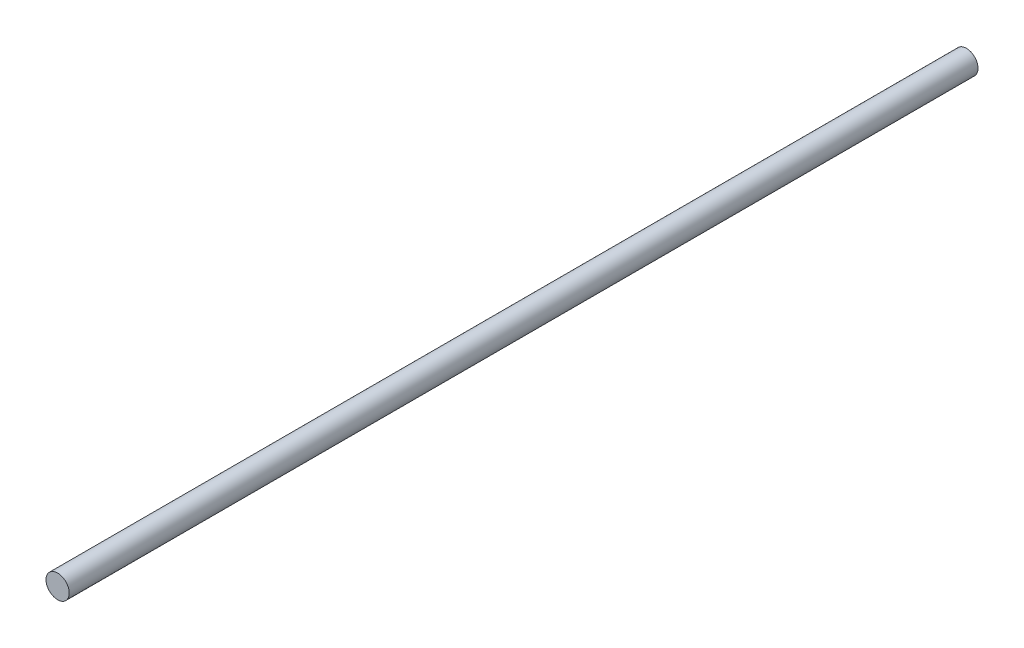
ISO-10303-21;
HEADER;
FILE_DESCRIPTION(('STEP AP214'),'2;1');
FILE_NAME('part.step','',(''),(''),'','','');
FILE_SCHEMA(('AUTOMOTIVE_DESIGN { 1 0 10303 214 1 1 1 1 }'));
ENDSEC;
DATA;
#1=APPLICATION_CONTEXT('core data for automotive mechanical design processes');
#2=APPLICATION_PROTOCOL_DEFINITION('international standard','automotive_design',2000,#1);
#3=PRODUCT_CONTEXT('',#1,'mechanical');
#4=PRODUCT('Part','Part','',(#3));
#5=PRODUCT_RELATED_PRODUCT_CATEGORY('part','',(#4));
#6=PRODUCT_DEFINITION_FORMATION('','',#4);
#7=PRODUCT_DEFINITION_CONTEXT('part definition',#1,'design');
#8=PRODUCT_DEFINITION('design','',#6,#7);
#9=PRODUCT_DEFINITION_SHAPE('','',#8);
#10=(LENGTH_UNIT() NAMED_UNIT(*) SI_UNIT(.MILLI.,.METRE.));
#11=(NAMED_UNIT(*) PLANE_ANGLE_UNIT() SI_UNIT($,.RADIAN.));
#12=(NAMED_UNIT(*) SI_UNIT($,.STERADIAN.) SOLID_ANGLE_UNIT());
#13=UNCERTAINTY_MEASURE_WITH_UNIT(LENGTH_MEASURE(1.E-05),#10,'distance_accuracy_value','');
#14=(GEOMETRIC_REPRESENTATION_CONTEXT(3) GLOBAL_UNCERTAINTY_ASSIGNED_CONTEXT((#13)) GLOBAL_UNIT_ASSIGNED_CONTEXT((#10,
#11,#12)) REPRESENTATION_CONTEXT('',''));
#15=CARTESIAN_POINT('',(0.,0.,0.));
#16=DIRECTION('',(0.,0.,1.));
#17=DIRECTION('',(1.,0.,0.));
#18=AXIS2_PLACEMENT_3D('',#15,#16,#17);
#19=CARTESIAN_POINT('',(0.,0.,235.));
#20=DIRECTION('',(0.,0.,-1.));
#21=DIRECTION('',(-1.,0.,0.));
#22=AXIS2_PLACEMENT_3D('',#19,#20,#21);
#23=CYLINDRICAL_SURFACE('',#22,3.);
#24=CARTESIAN_POINT('',(0.,0.,235.));
#25=DIRECTION('',(0.,0.,1.));
#26=DIRECTION('',(1.,0.,0.));
#27=AXIS2_PLACEMENT_3D('',#24,#25,#26);
#28=CIRCLE('',#27,3.);
#29=CARTESIAN_POINT('',(-3.,0.,235.));
#30=VERTEX_POINT('',#29);
#31=EDGE_CURVE('E10',#30,#30,#28,.T.);
#32=CARTESIAN_POINT('',(0.,0.,0.));
#33=DIRECTION('',(0.,0.,1.));
#34=DIRECTION('',(1.,0.,0.));
#35=AXIS2_PLACEMENT_3D('',#32,#33,#34);
#36=CIRCLE('',#35,3.);
#37=CARTESIAN_POINT('',(-3.,0.,0.));
#38=VERTEX_POINT('',#37);
#39=EDGE_CURVE('E44',#38,#38,#36,.T.);
#40=CARTESIAN_POINT('',(-3.,0.,235.));
#41=CARTESIAN_POINT('',(-3.,0.,232.552083333333));
#42=CARTESIAN_POINT('',(-3.,0.,230.104166666667));
#43=CARTESIAN_POINT('',(-3.,0.,225.208333333333));
#44=CARTESIAN_POINT('',(-3.,0.,222.760416666667));
#45=CARTESIAN_POINT('',(-3.,0.,217.864583333333));
#46=CARTESIAN_POINT('',(-3.,0.,215.416666666667));
#47=CARTESIAN_POINT('',(-3.,0.,210.520833333333));
#48=CARTESIAN_POINT('',(-3.,0.,208.072916666667));
#49=CARTESIAN_POINT('',(-3.,0.,203.177083333333));
#50=CARTESIAN_POINT('',(-3.,0.,200.729166666667));
#51=CARTESIAN_POINT('',(-3.,0.,195.833333333333));
#52=CARTESIAN_POINT('',(-3.,0.,193.385416666667));
#53=CARTESIAN_POINT('',(-3.,0.,188.489583333333));
#54=CARTESIAN_POINT('',(-3.,0.,186.041666666667));
#55=CARTESIAN_POINT('',(-3.,0.,181.145833333333));
#56=CARTESIAN_POINT('',(-3.,0.,178.697916666667));
#57=CARTESIAN_POINT('',(-3.,0.,173.802083333333));
#58=CARTESIAN_POINT('',(-3.,0.,171.354166666667));
#59=CARTESIAN_POINT('',(-3.,0.,166.458333333333));
#60=CARTESIAN_POINT('',(-3.,0.,164.010416666667));
#61=CARTESIAN_POINT('',(-3.,0.,159.114583333333));
#62=CARTESIAN_POINT('',(-3.,0.,156.666666666667));
#63=CARTESIAN_POINT('',(-3.,0.,151.770833333333));
#64=CARTESIAN_POINT('',(-3.,0.,149.322916666667));
#65=CARTESIAN_POINT('',(-3.,0.,144.427083333333));
#66=CARTESIAN_POINT('',(-3.,0.,141.979166666667));
#67=CARTESIAN_POINT('',(-3.,0.,137.083333333333));
#68=CARTESIAN_POINT('',(-3.,0.,134.635416666667));
#69=CARTESIAN_POINT('',(-3.,0.,129.739583333333));
#70=CARTESIAN_POINT('',(-3.,0.,127.291666666667));
#71=CARTESIAN_POINT('',(-3.,0.,122.395833333333));
#72=CARTESIAN_POINT('',(-3.,0.,119.947916666667));
#73=CARTESIAN_POINT('',(-3.,0.,115.052083333333));
#74=CARTESIAN_POINT('',(-3.,0.,112.604166666667));
#75=CARTESIAN_POINT('',(-3.,0.,107.708333333333));
#76=CARTESIAN_POINT('',(-3.,0.,105.260416666667));
#77=CARTESIAN_POINT('',(-3.,0.,100.364583333333));
#78=CARTESIAN_POINT('',(-3.,0.,97.9166666666667));
#79=CARTESIAN_POINT('',(-3.,0.,93.0208333333333));
#80=CARTESIAN_POINT('',(-3.,0.,90.5729166666667));
#81=CARTESIAN_POINT('',(-3.,0.,85.6770833333333));
#82=CARTESIAN_POINT('',(-3.,0.,83.2291666666667));
#83=CARTESIAN_POINT('',(-3.,0.,78.3333333333333));
#84=CARTESIAN_POINT('',(-3.,0.,75.8854166666667));
#85=CARTESIAN_POINT('',(-3.,0.,70.9895833333333));
#86=CARTESIAN_POINT('',(-3.,0.,68.5416666666667));
#87=CARTESIAN_POINT('',(-3.,0.,63.6458333333333));
#88=CARTESIAN_POINT('',(-3.,0.,61.1979166666667));
#89=CARTESIAN_POINT('',(-3.,0.,56.3020833333333));
#90=CARTESIAN_POINT('',(-3.,0.,53.8541666666667));
#91=CARTESIAN_POINT('',(-3.,0.,48.9583333333333));
#92=CARTESIAN_POINT('',(-3.,0.,46.5104166666667));
#93=CARTESIAN_POINT('',(-3.,0.,41.6145833333333));
#94=CARTESIAN_POINT('',(-3.,0.,39.1666666666666));
#95=CARTESIAN_POINT('',(-3.,0.,34.2708333333333));
#96=CARTESIAN_POINT('',(-3.,0.,31.8229166666666));
#97=CARTESIAN_POINT('',(-3.,0.,26.9270833333333));
#98=CARTESIAN_POINT('',(-3.,0.,24.4791666666666));
#99=CARTESIAN_POINT('',(-3.,0.,19.5833333333333));
#100=CARTESIAN_POINT('',(-3.,0.,17.1354166666666));
#101=CARTESIAN_POINT('',(-3.,0.,12.2395833333333));
#102=CARTESIAN_POINT('',(-3.,0.,9.79166666666664));
#103=CARTESIAN_POINT('',(-3.,0.,4.89583333333331));
#104=CARTESIAN_POINT('',(-3.,0.,2.44791666666664));
#105=CARTESIAN_POINT('',(-3.,0.,0.));
#106=B_SPLINE_CURVE_WITH_KNOTS('',3,(#40,#41,#42,#43,#44,#45,#46,#47,#48,#49,#50,#51,#52,#53,
#54,#55,#56,#57,#58,#59,#60,#61,#62,#63,#64,#65,#66,#67,#68,#69,#70,#71,#72,#73,#74,#75,#76,#77,
#78,#79,#80,#81,#82,#83,#84,#85,#86,#87,#88,#89,#90,#91,#92,#93,#94,#95,#96,#97,#98,#99,#100,
#101,#102,#103,#104,#105),.UNSPECIFIED.,.F.,.F.,(4,2,2,2,2,2,2,2,2,2,2,2,2,2,2,2,2,2,2,2,2,2,2,
2,2,2,2,2,2,2,2,2,4),(0.,7.34375000000001,14.6875,22.03125,29.375,36.71875,44.0625,51.40625,
58.75,66.09375,73.4375,80.78125,88.125,95.46875,102.8125,110.15625,117.5,124.84375,132.1875,
139.53125,146.875,154.21875,161.5625,168.90625,176.25,183.59375,190.9375,198.28125,205.625,
212.96875,220.3125,227.65625,235.),.UNSPECIFIED.);
#107=EDGE_CURVE('BSEAM41',#30,#38,#106,.T.);
#108=ORIENTED_EDGE('',*,*,#31,.F.);
#109=ORIENTED_EDGE('',*,*,#39,.T.);
#110=ORIENTED_EDGE('',*,*,#107,.T.);
#111=ORIENTED_EDGE('',*,*,#107,.F.);
#112=EDGE_LOOP('',(#108,#110,#109,#111));
#113=FACE_BOUND('',#112,.T.);
#114=ADVANCED_FACE('F41',(#113),#23,.T.);
#115=CARTESIAN_POINT('',(0.,0.,235.));
#116=DIRECTION('',(0.,0.,1.));
#117=DIRECTION('',(1.,0.,0.));
#118=AXIS2_PLACEMENT_3D('',#115,#116,#117);
#119=PLANE('',#118);
#120=ORIENTED_EDGE('',*,*,#31,.T.);
#121=EDGE_LOOP('',(#120));
#122=FACE_BOUND('',#121,.T.);
#123=ADVANCED_FACE('F58',(#122),#119,.T.);
#124=CARTESIAN_POINT('',(0.,0.,0.));
#125=DIRECTION('',(0.,0.,1.));
#126=DIRECTION('',(1.,0.,0.));
#127=AXIS2_PLACEMENT_3D('',#124,#125,#126);
#128=PLANE('',#127);
#129=ORIENTED_EDGE('',*,*,#39,.F.);
#130=EDGE_LOOP('',(#129));
#131=FACE_BOUND('',#130,.T.);
#132=ADVANCED_FACE('F56',(#131),#128,.F.);
#133=CLOSED_SHELL('',(#114,#123,#132));
#134=MANIFOLD_SOLID_BREP('B2',#133);
#135=ADVANCED_BREP_SHAPE_REPRESENTATION('',(#18,#134),#14);
#136=SHAPE_DEFINITION_REPRESENTATION(#9,#135);
ENDSEC;
END-ISO-10303-21;
